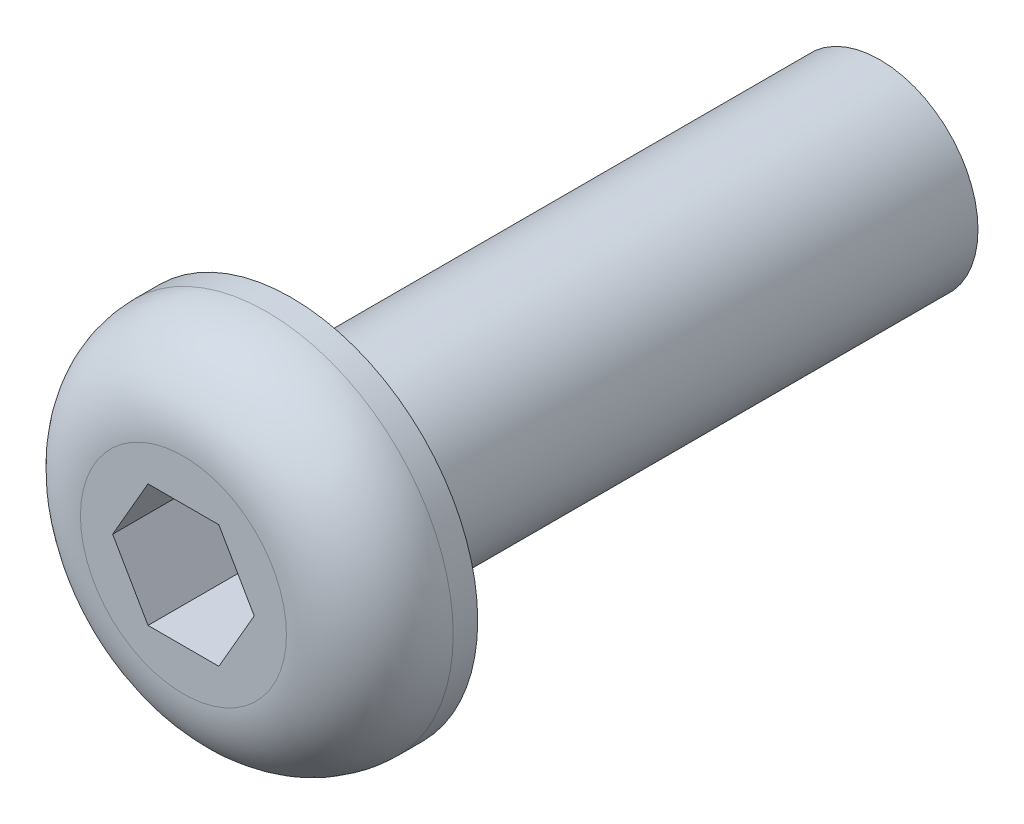
ISO-10303-21;
HEADER;
FILE_DESCRIPTION(('STEP AP214'),'2;1');
FILE_NAME('part.step','',(''),(''),'','','');
FILE_SCHEMA(('AUTOMOTIVE_DESIGN { 1 0 10303 214 1 1 1 1 }'));
ENDSEC;
DATA;
#1=APPLICATION_CONTEXT('core data for automotive mechanical design processes');
#2=APPLICATION_PROTOCOL_DEFINITION('international standard','automotive_design',2000,#1);
#3=PRODUCT_CONTEXT('',#1,'mechanical');
#4=PRODUCT('Part','Part','',(#3));
#5=PRODUCT_RELATED_PRODUCT_CATEGORY('part','',(#4));
#6=PRODUCT_DEFINITION_FORMATION('','',#4);
#7=PRODUCT_DEFINITION_CONTEXT('part definition',#1,'design');
#8=PRODUCT_DEFINITION('design','',#6,#7);
#9=PRODUCT_DEFINITION_SHAPE('','',#8);
#10=(LENGTH_UNIT() NAMED_UNIT(*) SI_UNIT(.MILLI.,.METRE.));
#11=(NAMED_UNIT(*) PLANE_ANGLE_UNIT() SI_UNIT($,.RADIAN.));
#12=(NAMED_UNIT(*) SI_UNIT($,.STERADIAN.) SOLID_ANGLE_UNIT());
#13=UNCERTAINTY_MEASURE_WITH_UNIT(LENGTH_MEASURE(1.E-05),#10,'distance_accuracy_value','');
#14=(GEOMETRIC_REPRESENTATION_CONTEXT(3) GLOBAL_UNCERTAINTY_ASSIGNED_CONTEXT((#13)) GLOBAL_UNIT_ASSIGNED_CONTEXT((#10,
#11,#12)) REPRESENTATION_CONTEXT('',''));
#15=CARTESIAN_POINT('',(0.,0.,0.));
#16=DIRECTION('',(0.,0.,1.));
#17=DIRECTION('',(1.,0.,0.));
#18=AXIS2_PLACEMENT_3D('',#15,#16,#17);
#19=CARTESIAN_POINT('',(0.,0.,-12.));
#20=DIRECTION('',(0.,0.,1.));
#21=DIRECTION('',(1.,0.,0.));
#22=AXIS2_PLACEMENT_3D('',#19,#20,#21);
#23=CYLINDRICAL_SURFACE('',#22,2.);
#24=CARTESIAN_POINT('',(0.,0.,-12.));
#25=DIRECTION('',(0.,0.,1.));
#26=DIRECTION('',(1.,0.,0.));
#27=AXIS2_PLACEMENT_3D('',#24,#25,#26);
#28=CIRCLE('',#27,2.);
#29=CARTESIAN_POINT('',(2.,0.,-12.));
#30=VERTEX_POINT('',#29);
#31=EDGE_CURVE('E11',#30,#30,#28,.T.);
#32=ORIENTED_EDGE('',*,*,#31,.T.);
#33=EDGE_LOOP('',(#32));
#34=FACE_BOUND('',#33,.T.);
#35=CARTESIAN_POINT('',(0.,0.,0.));
#36=DIRECTION('',(0.,0.,1.));
#37=DIRECTION('',(1.,0.,0.));
#38=AXIS2_PLACEMENT_3D('',#35,#36,#37);
#39=CIRCLE('',#38,2.);
#40=CARTESIAN_POINT('',(2.,0.,0.));
#41=VERTEX_POINT('',#40);
#42=EDGE_CURVE('E39',#41,#41,#39,.T.);
#43=ORIENTED_EDGE('',*,*,#42,.F.);
#44=EDGE_LOOP('',(#43));
#45=FACE_BOUND('',#44,.T.);
#46=ADVANCED_FACE('F36',(#34,#45),#23,.T.);
#47=CARTESIAN_POINT('',(0.,0.,-12.));
#48=DIRECTION('',(0.,0.,1.));
#49=DIRECTION('',(1.,0.,0.));
#50=AXIS2_PLACEMENT_3D('',#47,#48,#49);
#51=PLANE('',#50);
#52=ORIENTED_EDGE('',*,*,#31,.F.);
#53=EDGE_LOOP('',(#52));
#54=FACE_BOUND('',#53,.T.);
#55=ADVANCED_FACE('F159',(#54),#51,.F.);
#56=CARTESIAN_POINT('',(0.,0.,2.19999999999999));
#57=DIRECTION('',(0.,0.,1.));
#58=DIRECTION('',(1.,0.,0.));
#59=AXIS2_PLACEMENT_3D('',#56,#57,#58);
#60=PLANE('',#59);
#61=DIRECTION('',(-1.,0.,0.));
#62=VECTOR('',#61,1.);
#63=CARTESIAN_POINT('',(0.721687836487073,1.25,2.19999999999998));
#64=LINE('',#63,#62);
#65=CARTESIAN_POINT('',(0.721687836487073,1.25,2.19999999999998));
#66=VERTEX_POINT('',#65);
#67=CARTESIAN_POINT('',(-0.721687836487073,1.25,2.20000000000001));
#68=VERTEX_POINT('',#67);
#69=EDGE_CURVE('E50',#66,#68,#64,.T.);
#70=ORIENTED_EDGE('',*,*,#69,.F.);
#71=DIRECTION('',(-0.5,0.86602540378444,0.));
#72=VECTOR('',#71,1.);
#73=CARTESIAN_POINT('',(1.44337567297415,0.,2.19999999999999));
#74=LINE('',#73,#72);
#75=CARTESIAN_POINT('',(1.44337567297415,0.,2.19999999999999));
#76=VERTEX_POINT('',#75);
#77=EDGE_CURVE('E133',#76,#66,#74,.T.);
#78=ORIENTED_EDGE('',*,*,#77,.F.);
#79=DIRECTION('',(0.500000000000002,0.866025403784441,0.));
#80=VECTOR('',#79,1.);
#81=CARTESIAN_POINT('',(0.721687836487073,-1.25,2.19999999999999));
#82=LINE('',#81,#80);
#83=CARTESIAN_POINT('',(0.721687836487073,-1.25,2.19999999999999));
#84=VERTEX_POINT('',#83);
#85=EDGE_CURVE('E131',#84,#76,#82,.T.);
#86=ORIENTED_EDGE('',*,*,#85,.F.);
#87=DIRECTION('',(1.,0.,0.));
#88=VECTOR('',#87,1.);
#89=CARTESIAN_POINT('',(-0.721687836487073,-1.25,2.19999999999999));
#90=LINE('',#89,#88);
#91=CARTESIAN_POINT('',(-0.721687836487073,-1.25,2.19999999999999));
#92=VERTEX_POINT('',#91);
#93=EDGE_CURVE('E98',#92,#84,#90,.T.);
#94=ORIENTED_EDGE('',*,*,#93,.F.);
#95=DIRECTION('',(0.5,-0.86602540378444,0.));
#96=VECTOR('',#95,1.);
#97=CARTESIAN_POINT('',(-1.44337567297392,0.,2.19999999999999));
#98=LINE('',#97,#96);
#99=CARTESIAN_POINT('',(-1.44337567297392,0.,2.19999999999999));
#100=VERTEX_POINT('',#99);
#101=EDGE_CURVE('E127',#100,#92,#98,.T.);
#102=ORIENTED_EDGE('',*,*,#101,.F.);
#103=DIRECTION('',(-0.500000000000002,-0.866025403784441,0.));
#104=VECTOR('',#103,1.);
#105=CARTESIAN_POINT('',(-0.721687836487073,1.25,2.20000000000001));
#106=LINE('',#105,#104);
#107=EDGE_CURVE('E124',#68,#100,#106,.T.);
#108=ORIENTED_EDGE('',*,*,#107,.F.);
#109=EDGE_LOOP('',(#70,#78,#86,#94,#102,#108));
#110=FACE_BOUND('',#109,.T.);
#111=CARTESIAN_POINT('',(0.,0.,2.19999999999999));
#112=DIRECTION('',(0.,0.,-1.));
#113=DIRECTION('',(-1.,0.,0.));
#114=AXIS2_PLACEMENT_3D('',#111,#112,#113);
#115=CIRCLE('',#114,2.1);
#116=CARTESIAN_POINT('',(-2.1,0.,2.19999999999999));
#117=VERTEX_POINT('',#116);
#118=EDGE_CURVE('E148',#117,#117,#115,.T.);
#119=ORIENTED_EDGE('',*,*,#118,.F.);
#120=EDGE_LOOP('',(#119));
#121=FACE_BOUND('',#120,.T.);
#122=ADVANCED_FACE('F164',(#110,#121),#60,.T.);
#123=CARTESIAN_POINT('',(0.,0.,0.5));
#124=DIRECTION('',(0.,0.,-1.));
#125=DIRECTION('',(-1.,0.,0.));
#126=AXIS2_PLACEMENT_3D('',#123,#124,#125);
#127=TOROIDAL_SURFACE('',#126,2.1,1.7);
#128=ORIENTED_EDGE('',*,*,#118,.T.);
#129=EDGE_LOOP('',(#128));
#130=FACE_BOUND('',#129,.T.);
#131=CARTESIAN_POINT('',(0.,0.,0.5));
#132=DIRECTION('',(0.,0.,-1.));
#133=DIRECTION('',(-1.,0.,0.));
#134=AXIS2_PLACEMENT_3D('',#131,#132,#133);
#135=CIRCLE('',#134,3.8);
#136=CARTESIAN_POINT('',(-3.80000000000001,0.,0.5));
#137=VERTEX_POINT('',#136);
#138=EDGE_CURVE('E145',#137,#137,#135,.T.);
#139=ORIENTED_EDGE('',*,*,#138,.F.);
#140=EDGE_LOOP('',(#139));
#141=FACE_BOUND('',#140,.T.);
#142=ADVANCED_FACE('F170',(#130,#141),#127,.T.);
#143=CARTESIAN_POINT('',(0.,0.,0.));
#144=DIRECTION('',(0.,0.,-1.));
#145=DIRECTION('',(-1.,0.,0.));
#146=AXIS2_PLACEMENT_3D('',#143,#144,#145);
#147=CYLINDRICAL_SURFACE('',#146,3.8);
#148=ORIENTED_EDGE('',*,*,#138,.T.);
#149=EDGE_LOOP('',(#148));
#150=FACE_BOUND('',#149,.T.);
#151=CARTESIAN_POINT('',(0.,0.,0.));
#152=DIRECTION('',(0.,0.,-1.));
#153=DIRECTION('',(-1.,0.,0.));
#154=AXIS2_PLACEMENT_3D('',#151,#152,#153);
#155=CIRCLE('',#154,3.8);
#156=CARTESIAN_POINT('',(-3.80000000000001,0.,0.));
#157=VERTEX_POINT('',#156);
#158=EDGE_CURVE('E137',#157,#157,#155,.T.);
#159=ORIENTED_EDGE('',*,*,#158,.F.);
#160=EDGE_LOOP('',(#159));
#161=FACE_BOUND('',#160,.T.);
#162=ADVANCED_FACE('F176',(#150,#161),#147,.T.);
#163=CARTESIAN_POINT('',(0.,0.,0.));
#164=DIRECTION('',(0.,0.,-1.));
#165=DIRECTION('',(-1.,0.,0.));
#166=AXIS2_PLACEMENT_3D('',#163,#164,#165);
#167=PLANE('',#166);
#168=ORIENTED_EDGE('',*,*,#42,.T.);
#169=EDGE_LOOP('',(#168));
#170=FACE_BOUND('',#169,.T.);
#171=ORIENTED_EDGE('',*,*,#158,.T.);
#172=EDGE_LOOP('',(#171));
#173=FACE_BOUND('',#172,.T.);
#174=ADVANCED_FACE('F155',(#170,#173),#167,.T.);
#175=CARTESIAN_POINT('',(0.721687836487073,1.25,0.199999999999992));
#176=DIRECTION('',(0.,1.,0.));
#177=DIRECTION('',(0.,0.,1.));
#178=AXIS2_PLACEMENT_3D('',#175,#176,#177);
#179=PLANE('',#178);
#180=ORIENTED_EDGE('',*,*,#69,.T.);
#181=DIRECTION('',(0.,0.,1.));
#182=VECTOR('',#181,1.);
#183=CARTESIAN_POINT('',(-0.721687836487073,1.25,0.20000000000002));
#184=LINE('',#183,#182);
#185=CARTESIAN_POINT('',(-0.721687836487073,1.25,0.20000000000002));
#186=VERTEX_POINT('',#185);
#187=EDGE_CURVE('E80',#186,#68,#184,.T.);
#188=ORIENTED_EDGE('',*,*,#187,.F.);
#189=DIRECTION('',(-1.,0.,0.));
#190=VECTOR('',#189,1.);
#191=CARTESIAN_POINT('',(0.721687836487073,1.25,0.199999999999992));
#192=LINE('',#191,#190);
#193=CARTESIAN_POINT('',(0.721687836487073,1.25,0.199999999999992));
#194=VERTEX_POINT('',#193);
#195=EDGE_CURVE('E135',#194,#186,#192,.T.);
#196=ORIENTED_EDGE('',*,*,#195,.F.);
#197=DIRECTION('',(0.,0.,1.));
#198=VECTOR('',#197,1.);
#199=CARTESIAN_POINT('',(0.721687836487073,1.25,0.199999999999992));
#200=LINE('',#199,#198);
#201=EDGE_CURVE('E58',#194,#66,#200,.T.);
#202=ORIENTED_EDGE('',*,*,#201,.T.);
#203=EDGE_LOOP('',(#180,#188,#196,#202));
#204=FACE_BOUND('',#203,.T.);
#205=ADVANCED_FACE('F182',(#204),#179,.F.);
#206=CARTESIAN_POINT('',(1.44337567297392,0.,0.200000000000006));
#207=DIRECTION('',(0.866025403784441,0.500000000000002,0.));
#208=DIRECTION('',(-0.5,0.86602540378444,0.));
#209=AXIS2_PLACEMENT_3D('',#206,#207,#208);
#210=PLANE('',#209);
#211=ORIENTED_EDGE('',*,*,#77,.T.);
#212=ORIENTED_EDGE('',*,*,#201,.F.);
#213=DIRECTION('',(-0.5,0.86602540378444,0.));
#214=VECTOR('',#213,1.);
#215=CARTESIAN_POINT('',(1.44337567297392,0.,0.200000000000006));
#216=LINE('',#215,#214);
#217=CARTESIAN_POINT('',(1.44337567297392,0.,0.200000000000006));
#218=VERTEX_POINT('',#217);
#219=EDGE_CURVE('E110',#218,#194,#216,.T.);
#220=ORIENTED_EDGE('',*,*,#219,.F.);
#221=DIRECTION('',(0.,0.,1.));
#222=VECTOR('',#221,1.);
#223=CARTESIAN_POINT('',(1.44337567297392,0.,0.200000000000006));
#224=LINE('',#223,#222);
#225=EDGE_CURVE('E102',#218,#76,#224,.T.);
#226=ORIENTED_EDGE('',*,*,#225,.T.);
#227=EDGE_LOOP('',(#211,#212,#220,#226));
#228=FACE_BOUND('',#227,.T.);
#229=ADVANCED_FACE('F185',(#228),#210,.F.);
#230=CARTESIAN_POINT('',(0.721687836487073,-1.25,0.200000000000006));
#231=DIRECTION('',(0.86602540378444,-0.5,0.));
#232=DIRECTION('',(0.500000000000002,0.866025403784441,0.));
#233=AXIS2_PLACEMENT_3D('',#230,#231,#232);
#234=PLANE('',#233);
#235=ORIENTED_EDGE('',*,*,#85,.T.);
#236=ORIENTED_EDGE('',*,*,#225,.F.);
#237=DIRECTION('',(0.500000000000002,0.866025403784441,0.));
#238=VECTOR('',#237,1.);
#239=CARTESIAN_POINT('',(0.721687836487073,-1.25,0.200000000000006));
#240=LINE('',#239,#238);
#241=CARTESIAN_POINT('',(0.721687836487073,-1.25,0.200000000000006));
#242=VERTEX_POINT('',#241);
#243=EDGE_CURVE('E106',#242,#218,#240,.T.);
#244=ORIENTED_EDGE('',*,*,#243,.F.);
#245=DIRECTION('',(0.,0.,1.));
#246=VECTOR('',#245,1.);
#247=CARTESIAN_POINT('',(0.721687836487073,-1.25,0.200000000000006));
#248=LINE('',#247,#246);
#249=EDGE_CURVE('E91',#242,#84,#248,.T.);
#250=ORIENTED_EDGE('',*,*,#249,.T.);
#251=EDGE_LOOP('',(#235,#236,#244,#250));
#252=FACE_BOUND('',#251,.T.);
#253=ADVANCED_FACE('F107',(#252),#234,.F.);
#254=CARTESIAN_POINT('',(-0.721687836487073,-1.25,0.200000000000006));
#255=DIRECTION('',(0.,-1.,0.));
#256=DIRECTION('',(1.,0.,0.));
#257=AXIS2_PLACEMENT_3D('',#254,#255,#256);
#258=PLANE('',#257);
#259=ORIENTED_EDGE('',*,*,#93,.T.);
#260=ORIENTED_EDGE('',*,*,#249,.F.);
#261=DIRECTION('',(1.,0.,0.));
#262=VECTOR('',#261,1.);
#263=CARTESIAN_POINT('',(-0.721687836487073,-1.25,0.200000000000006));
#264=LINE('',#263,#262);
#265=CARTESIAN_POINT('',(-0.721687836487073,-1.25,0.200000000000006));
#266=VERTEX_POINT('',#265);
#267=EDGE_CURVE('E95',#266,#242,#264,.T.);
#268=ORIENTED_EDGE('',*,*,#267,.F.);
#269=DIRECTION('',(0.,0.,1.));
#270=VECTOR('',#269,1.);
#271=CARTESIAN_POINT('',(-0.721687836487073,-1.25,0.200000000000006));
#272=LINE('',#271,#270);
#273=EDGE_CURVE('E103',#266,#92,#272,.T.);
#274=ORIENTED_EDGE('',*,*,#273,.T.);
#275=EDGE_LOOP('',(#259,#260,#268,#274));
#276=FACE_BOUND('',#275,.T.);
#277=ADVANCED_FACE('F93',(#276),#258,.F.);
#278=CARTESIAN_POINT('',(-1.44337567297392,0.,0.200000000000006));
#279=DIRECTION('',(-0.866025403784441,-0.500000000000002,0.));
#280=DIRECTION('',(0.5,-0.86602540378444,0.));
#281=AXIS2_PLACEMENT_3D('',#278,#279,#280);
#282=PLANE('',#281);
#283=ORIENTED_EDGE('',*,*,#101,.T.);
#284=ORIENTED_EDGE('',*,*,#273,.F.);
#285=DIRECTION('',(0.5,-0.86602540378444,0.));
#286=VECTOR('',#285,1.);
#287=CARTESIAN_POINT('',(-1.44337567297392,0.,0.200000000000006));
#288=LINE('',#287,#286);
#289=CARTESIAN_POINT('',(-1.44337567297392,0.,0.200000000000006));
#290=VERTEX_POINT('',#289);
#291=EDGE_CURVE('E116',#290,#266,#288,.T.);
#292=ORIENTED_EDGE('',*,*,#291,.F.);
#293=DIRECTION('',(0.,0.,1.));
#294=VECTOR('',#293,1.);
#295=CARTESIAN_POINT('',(-1.44337567297392,0.,0.200000000000006));
#296=LINE('',#295,#294);
#297=EDGE_CURVE('E140',#290,#100,#296,.T.);
#298=ORIENTED_EDGE('',*,*,#297,.T.);
#299=EDGE_LOOP('',(#283,#284,#292,#298));
#300=FACE_BOUND('',#299,.T.);
#301=ADVANCED_FACE('F189',(#300),#282,.F.);
#302=CARTESIAN_POINT('',(-0.721687836487073,1.25,0.20000000000002));
#303=DIRECTION('',(-0.86602540378444,0.5,0.));
#304=DIRECTION('',(-0.500000000000002,-0.866025403784441,0.));
#305=AXIS2_PLACEMENT_3D('',#302,#303,#304);
#306=PLANE('',#305);
#307=ORIENTED_EDGE('',*,*,#107,.T.);
#308=ORIENTED_EDGE('',*,*,#297,.F.);
#309=DIRECTION('',(-0.500000000000002,-0.866025403784441,0.));
#310=VECTOR('',#309,1.);
#311=CARTESIAN_POINT('',(-0.721687836487073,1.25,0.20000000000002));
#312=LINE('',#311,#310);
#313=EDGE_CURVE('E118',#186,#290,#312,.T.);
#314=ORIENTED_EDGE('',*,*,#313,.F.);
#315=ORIENTED_EDGE('',*,*,#187,.T.);
#316=EDGE_LOOP('',(#307,#308,#314,#315));
#317=FACE_BOUND('',#316,.T.);
#318=ADVANCED_FACE('F186',(#317),#306,.F.);
#319=CARTESIAN_POINT('',(-2.16506350946122,1.25,0.20000000000002));
#320=DIRECTION('',(0.,0.,1.));
#321=DIRECTION('',(1.,0.,0.));
#322=AXIS2_PLACEMENT_3D('',#319,#320,#321);
#323=PLANE('',#322);
#324=ORIENTED_EDGE('',*,*,#195,.T.);
#325=ORIENTED_EDGE('',*,*,#313,.T.);
#326=ORIENTED_EDGE('',*,*,#291,.T.);
#327=ORIENTED_EDGE('',*,*,#267,.T.);
#328=ORIENTED_EDGE('',*,*,#243,.T.);
#329=ORIENTED_EDGE('',*,*,#219,.T.);
#330=EDGE_LOOP('',(#324,#325,#326,#327,#328,#329));
#331=FACE_BOUND('',#330,.T.);
#332=ADVANCED_FACE('F113',(#331),#323,.T.);
#333=CLOSED_SHELL('',(#46,#55,#122,#142,#162,#174,#205,#229,#253,#277,#301,#318,#332));
#334=MANIFOLD_SOLID_BREP('B2',#333);
#335=ADVANCED_BREP_SHAPE_REPRESENTATION('',(#18,#334),#14);
#336=SHAPE_DEFINITION_REPRESENTATION(#9,#335);
ENDSEC;
END-ISO-10303-21;
